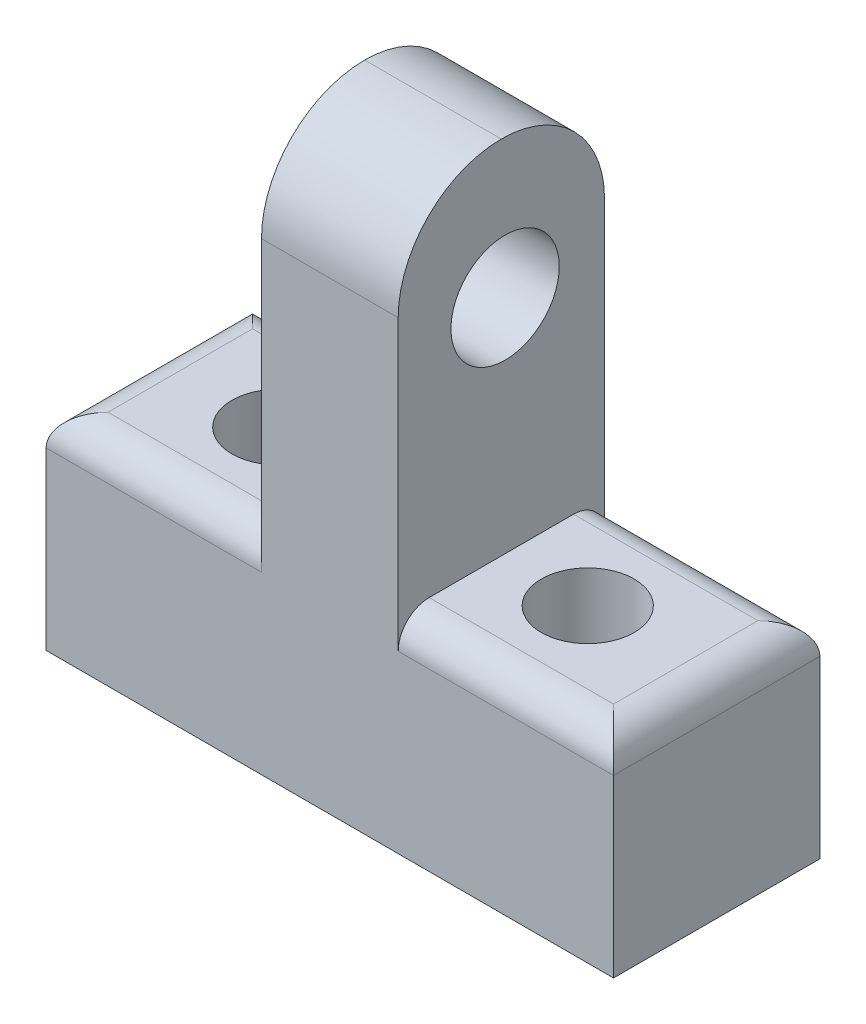
ISO-10303-21;
HEADER;
FILE_DESCRIPTION(('STEP AP214'),'2;1');
FILE_NAME('part.step','',(''),(''),'','','');
FILE_SCHEMA(('AUTOMOTIVE_DESIGN { 1 0 10303 214 1 1 1 1 }'));
ENDSEC;
DATA;
#1=APPLICATION_CONTEXT('core data for automotive mechanical design processes');
#2=APPLICATION_PROTOCOL_DEFINITION('international standard','automotive_design',2000,#1);
#3=PRODUCT_CONTEXT('',#1,'mechanical');
#4=PRODUCT('Part','Part','',(#3));
#5=PRODUCT_RELATED_PRODUCT_CATEGORY('part','',(#4));
#6=PRODUCT_DEFINITION_FORMATION('','',#4);
#7=PRODUCT_DEFINITION_CONTEXT('part definition',#1,'design');
#8=PRODUCT_DEFINITION('design','',#6,#7);
#9=PRODUCT_DEFINITION_SHAPE('','',#8);
#10=(LENGTH_UNIT() NAMED_UNIT(*) SI_UNIT(.MILLI.,.METRE.));
#11=(NAMED_UNIT(*) PLANE_ANGLE_UNIT() SI_UNIT($,.RADIAN.));
#12=(NAMED_UNIT(*) SI_UNIT($,.STERADIAN.) SOLID_ANGLE_UNIT());
#13=UNCERTAINTY_MEASURE_WITH_UNIT(LENGTH_MEASURE(1.E-05),#10,'distance_accuracy_value','');
#14=(GEOMETRIC_REPRESENTATION_CONTEXT(3) GLOBAL_UNCERTAINTY_ASSIGNED_CONTEXT((#13)) GLOBAL_UNIT_ASSIGNED_CONTEXT((#10,
#11,#12)) REPRESENTATION_CONTEXT('',''));
#15=CARTESIAN_POINT('',(0.,0.,0.));
#16=DIRECTION('',(0.,0.,1.));
#17=DIRECTION('',(1.,0.,0.));
#18=AXIS2_PLACEMENT_3D('',#15,#16,#17);
#19=CARTESIAN_POINT('',(0.,20.,0.));
#20=DIRECTION('',(0.,-1.,0.));
#21=DIRECTION('',(0.,0.,-1.));
#22=AXIS2_PLACEMENT_3D('',#19,#20,#21);
#23=PLANE('',#22);
#24=CARTESIAN_POINT('',(15.,20.,0.));
#25=DIRECTION('',(0.,1.,0.));
#26=DIRECTION('',(0.,0.,-1.));
#27=AXIS2_PLACEMENT_3D('',#24,#25,#26);
#28=CIRCLE('',#27,4.5);
#29=CARTESIAN_POINT('',(15.,20.,-4.50000000000001));
#30=VERTEX_POINT('',#29);
#31=EDGE_CURVE('E305',#30,#30,#28,.T.);
#32=ORIENTED_EDGE('',*,*,#31,.F.);
#33=EDGE_LOOP('',(#32));
#34=FACE_BOUND('',#33,.T.);
#35=DIRECTION('',(0.,0.,-1.));
#36=VECTOR('',#35,1.);
#37=CARTESIAN_POINT('',(6.62684365523114,20.,10.));
#38=LINE('',#37,#36);
#39=CARTESIAN_POINT('',(6.62684365523114,20.,7.));
#40=VERTEX_POINT('',#39);
#41=CARTESIAN_POINT('',(6.62684365523114,20.,-7.));
#42=VERTEX_POINT('',#41);
#43=EDGE_CURVE('E277',#40,#42,#38,.T.);
#44=ORIENTED_EDGE('',*,*,#43,.F.);
#45=DIRECTION('',(1.,0.,0.));
#46=VECTOR('',#45,1.);
#47=CARTESIAN_POINT('',(0.,20.,7.));
#48=LINE('',#47,#46);
#49=CARTESIAN_POINT('',(24.5,20.,7.));
#50=VERTEX_POINT('',#49);
#51=EDGE_CURVE('E245',#40,#50,#48,.T.);
#52=ORIENTED_EDGE('',*,*,#51,.T.);
#53=DIRECTION('',(0.,0.,-1.));
#54=VECTOR('',#53,1.);
#55=CARTESIAN_POINT('',(24.5,20.,0.));
#56=LINE('',#55,#54);
#57=CARTESIAN_POINT('',(24.5,20.,-7.));
#58=VERTEX_POINT('',#57);
#59=EDGE_CURVE('E242',#50,#58,#56,.T.);
#60=ORIENTED_EDGE('',*,*,#59,.T.);
#61=DIRECTION('',(-1.,0.,0.));
#62=VECTOR('',#61,1.);
#63=CARTESIAN_POINT('',(0.,20.,-7.));
#64=LINE('',#63,#62);
#65=EDGE_CURVE('E232',#58,#42,#64,.T.);
#66=ORIENTED_EDGE('',*,*,#65,.T.);
#67=EDGE_LOOP('',(#44,#52,#60,#66));
#68=FACE_BOUND('',#67,.T.);
#69=ADVANCED_FACE('F39',(#34,#68),#23,.F.);
#70=DIRECTION('',(0.,0.,1.));
#71=VECTOR('',#70,1.);
#72=CARTESIAN_POINT('',(-24.5,20.,0.));
#73=LINE('',#72,#71);
#74=CARTESIAN_POINT('',(-24.5,20.,-7.));
#75=VERTEX_POINT('',#74);
#76=CARTESIAN_POINT('',(-24.5,20.,7.));
#77=VERTEX_POINT('',#76);
#78=EDGE_CURVE('E199',#75,#77,#73,.T.);
#79=ORIENTED_EDGE('',*,*,#78,.T.);
#80=DIRECTION('',(1.,0.,0.));
#81=VECTOR('',#80,1.);
#82=CARTESIAN_POINT('',(0.,20.,7.));
#83=LINE('',#82,#81);
#84=CARTESIAN_POINT('',(-6.62684365523114,20.,7.));
#85=VERTEX_POINT('',#84);
#86=EDGE_CURVE('E211',#77,#85,#83,.T.);
#87=ORIENTED_EDGE('',*,*,#86,.T.);
#88=DIRECTION('',(0.,0.,-1.));
#89=VECTOR('',#88,1.);
#90=CARTESIAN_POINT('',(-6.62684365523114,20.,10.));
#91=LINE('',#90,#89);
#92=CARTESIAN_POINT('',(-6.62684365523114,20.,-7.));
#93=VERTEX_POINT('',#92);
#94=EDGE_CURVE('E282',#85,#93,#91,.T.);
#95=ORIENTED_EDGE('',*,*,#94,.T.);
#96=DIRECTION('',(-1.,0.,0.));
#97=VECTOR('',#96,1.);
#98=CARTESIAN_POINT('',(0.,20.,-7.));
#99=LINE('',#98,#97);
#100=EDGE_CURVE('E208',#93,#75,#99,.T.);
#101=ORIENTED_EDGE('',*,*,#100,.T.);
#102=EDGE_LOOP('',(#79,#87,#95,#101));
#103=FACE_BOUND('',#102,.T.);
#104=CARTESIAN_POINT('',(-15.,20.,0.));
#105=DIRECTION('',(0.,1.,0.));
#106=DIRECTION('',(0.,0.,1.));
#107=AXIS2_PLACEMENT_3D('',#104,#105,#106);
#108=CIRCLE('',#107,4.5);
#109=CARTESIAN_POINT('',(-15.,20.,4.5));
#110=VERTEX_POINT('',#109);
#111=EDGE_CURVE('E162',#110,#110,#108,.T.);
#112=ORIENTED_EDGE('',*,*,#111,.F.);
#113=EDGE_LOOP('',(#112));
#114=FACE_BOUND('',#113,.T.);
#115=ADVANCED_FACE('F330',(#103,#114),#23,.F.);
#116=CARTESIAN_POINT('',(0.,0.,0.));
#117=DIRECTION('',(0.,-1.,0.));
#118=DIRECTION('',(0.,0.,-1.));
#119=AXIS2_PLACEMENT_3D('',#116,#117,#118);
#120=PLANE('',#119);
#121=CARTESIAN_POINT('',(-15.,0.,0.));
#122=DIRECTION('',(0.,1.,0.));
#123=DIRECTION('',(0.,0.,1.));
#124=AXIS2_PLACEMENT_3D('',#121,#122,#123);
#125=CIRCLE('',#124,4.5);
#126=CARTESIAN_POINT('',(-15.,0.,4.5));
#127=VERTEX_POINT('',#126);
#128=EDGE_CURVE('E166',#127,#127,#125,.T.);
#129=ORIENTED_EDGE('',*,*,#128,.T.);
#130=EDGE_LOOP('',(#129));
#131=FACE_BOUND('',#130,.T.);
#132=DIRECTION('',(0.,0.,-1.));
#133=VECTOR('',#132,1.);
#134=CARTESIAN_POINT('',(27.5,0.,10.));
#135=LINE('',#134,#133);
#136=CARTESIAN_POINT('',(27.5,0.,10.));
#137=VERTEX_POINT('',#136);
#138=CARTESIAN_POINT('',(27.5,0.,-10.));
#139=VERTEX_POINT('',#138);
#140=EDGE_CURVE('E152',#137,#139,#135,.T.);
#141=ORIENTED_EDGE('',*,*,#140,.F.);
#142=DIRECTION('',(1.,0.,0.));
#143=VECTOR('',#142,1.);
#144=CARTESIAN_POINT('',(-27.5,0.,10.));
#145=LINE('',#144,#143);
#146=CARTESIAN_POINT('',(-27.5,0.,10.));
#147=VERTEX_POINT('',#146);
#148=EDGE_CURVE('E172',#147,#137,#145,.T.);
#149=ORIENTED_EDGE('',*,*,#148,.F.);
#150=DIRECTION('',(0.,0.,1.));
#151=VECTOR('',#150,1.);
#152=CARTESIAN_POINT('',(-27.5,0.,10.));
#153=LINE('',#152,#151);
#154=CARTESIAN_POINT('',(-27.5,0.,-10.));
#155=VERTEX_POINT('',#154);
#156=EDGE_CURVE('E154',#155,#147,#153,.T.);
#157=ORIENTED_EDGE('',*,*,#156,.F.);
#158=DIRECTION('',(-1.,0.,0.));
#159=VECTOR('',#158,1.);
#160=CARTESIAN_POINT('',(-27.5,0.,-10.));
#161=LINE('',#160,#159);
#162=EDGE_CURVE('E138',#139,#155,#161,.T.);
#163=ORIENTED_EDGE('',*,*,#162,.F.);
#164=EDGE_LOOP('',(#141,#149,#157,#163));
#165=FACE_BOUND('',#164,.T.);
#166=CARTESIAN_POINT('',(15.,0.,0.));
#167=DIRECTION('',(0.,1.,0.));
#168=DIRECTION('',(0.,0.,-1.));
#169=AXIS2_PLACEMENT_3D('',#166,#167,#168);
#170=CIRCLE('',#169,4.5);
#171=CARTESIAN_POINT('',(15.,0.,-4.50000000000001));
#172=VERTEX_POINT('',#171);
#173=EDGE_CURVE('E296',#172,#172,#170,.T.);
#174=ORIENTED_EDGE('',*,*,#173,.T.);
#175=EDGE_LOOP('',(#174));
#176=FACE_BOUND('',#175,.T.);
#177=ADVANCED_FACE('F149',(#131,#165,#176),#120,.T.);
#178=CARTESIAN_POINT('',(27.5,20.,10.));
#179=DIRECTION('',(-1.,0.,0.));
#180=DIRECTION('',(0.,0.,1.));
#181=AXIS2_PLACEMENT_3D('',#178,#179,#180);
#182=PLANE('',#181);
#183=DIRECTION('',(0.,-1.,0.));
#184=VECTOR('',#183,1.);
#185=CARTESIAN_POINT('',(27.5,20.,-10.));
#186=LINE('',#185,#184);
#187=CARTESIAN_POINT('',(27.5,17.,-10.));
#188=VERTEX_POINT('',#187);
#189=EDGE_CURVE('E134',#188,#139,#186,.T.);
#190=ORIENTED_EDGE('',*,*,#189,.F.);
#191=DIRECTION('',(0.,0.,-1.));
#192=VECTOR('',#191,1.);
#193=CARTESIAN_POINT('',(27.5,17.,10.));
#194=LINE('',#193,#192);
#195=CARTESIAN_POINT('',(27.5,17.,10.));
#196=VERTEX_POINT('',#195);
#197=EDGE_CURVE('E253',#188,#196,#194,.F.);
#198=ORIENTED_EDGE('',*,*,#197,.T.);
#199=DIRECTION('',(0.,-1.,0.));
#200=VECTOR('',#199,1.);
#201=CARTESIAN_POINT('',(27.5,20.,10.));
#202=LINE('',#201,#200);
#203=EDGE_CURVE('E159',#196,#137,#202,.T.);
#204=ORIENTED_EDGE('',*,*,#203,.T.);
#205=ORIENTED_EDGE('',*,*,#140,.T.);
#206=EDGE_LOOP('',(#190,#198,#204,#205));
#207=FACE_BOUND('',#206,.T.);
#208=ADVANCED_FACE('F157',(#207),#182,.F.);
#209=CARTESIAN_POINT('',(-27.5,20.,-10.));
#210=DIRECTION('',(0.,0.,1.));
#211=DIRECTION('',(1.,0.,0.));
#212=AXIS2_PLACEMENT_3D('',#209,#210,#211);
#213=PLANE('',#212);
#214=DIRECTION('',(0.,-1.,0.));
#215=VECTOR('',#214,1.);
#216=CARTESIAN_POINT('',(6.62684365523114,55.,-10.));
#217=LINE('',#216,#215);
#218=CARTESIAN_POINT('',(6.62684365523114,45.,-10.));
#219=VERTEX_POINT('',#218);
#220=CARTESIAN_POINT('',(6.62684365523114,17.,-10.));
#221=VERTEX_POINT('',#220);
#222=EDGE_CURVE('E57',#219,#221,#217,.T.);
#223=ORIENTED_EDGE('',*,*,#222,.T.);
#224=DIRECTION('',(-1.,0.,0.));
#225=VECTOR('',#224,1.);
#226=CARTESIAN_POINT('',(-27.5,17.,-10.));
#227=LINE('',#226,#225);
#228=EDGE_CURVE('E61',#221,#188,#227,.F.);
#229=ORIENTED_EDGE('',*,*,#228,.T.);
#230=ORIENTED_EDGE('',*,*,#189,.T.);
#231=ORIENTED_EDGE('',*,*,#162,.T.);
#232=DIRECTION('',(0.,-1.,0.));
#233=VECTOR('',#232,1.);
#234=CARTESIAN_POINT('',(-27.5,20.,-10.));
#235=LINE('',#234,#233);
#236=CARTESIAN_POINT('',(-27.5,17.,-10.));
#237=VERTEX_POINT('',#236);
#238=EDGE_CURVE('E145',#237,#155,#235,.T.);
#239=ORIENTED_EDGE('',*,*,#238,.F.);
#240=DIRECTION('',(-1.,0.,0.));
#241=VECTOR('',#240,1.);
#242=CARTESIAN_POINT('',(-27.5,17.,-10.));
#243=LINE('',#242,#241);
#244=CARTESIAN_POINT('',(-6.62684365523114,17.,-10.));
#245=VERTEX_POINT('',#244);
#246=EDGE_CURVE('E218',#237,#245,#243,.F.);
#247=ORIENTED_EDGE('',*,*,#246,.T.);
#248=DIRECTION('',(0.,-1.,0.));
#249=VECTOR('',#248,1.);
#250=CARTESIAN_POINT('',(-6.62684365523114,55.,-10.));
#251=LINE('',#250,#249);
#252=CARTESIAN_POINT('',(-6.62684365523114,45.,-10.));
#253=VERTEX_POINT('',#252);
#254=EDGE_CURVE('E293',#253,#245,#251,.T.);
#255=ORIENTED_EDGE('',*,*,#254,.F.);
#256=DIRECTION('',(1.,0.,0.));
#257=VECTOR('',#256,1.);
#258=CARTESIAN_POINT('',(6.62684365523114,45.,-10.));
#259=LINE('',#258,#257);
#260=EDGE_CURVE('E144',#253,#219,#259,.T.);
#261=ORIENTED_EDGE('',*,*,#260,.T.);
#262=EDGE_LOOP('',(#223,#229,#230,#231,#239,#247,#255,#261));
#263=FACE_BOUND('',#262,.T.);
#264=ADVANCED_FACE('F136',(#263),#213,.F.);
#265=CARTESIAN_POINT('',(-27.5,20.,10.));
#266=DIRECTION('',(1.,0.,0.));
#267=DIRECTION('',(0.,0.,-1.));
#268=AXIS2_PLACEMENT_3D('',#265,#266,#267);
#269=PLANE('',#268);
#270=DIRECTION('',(0.,-1.,0.));
#271=VECTOR('',#270,1.);
#272=CARTESIAN_POINT('',(-27.5,20.,10.));
#273=LINE('',#272,#271);
#274=CARTESIAN_POINT('',(-27.5,17.,10.));
#275=VERTEX_POINT('',#274);
#276=EDGE_CURVE('E177',#275,#147,#273,.T.);
#277=ORIENTED_EDGE('',*,*,#276,.F.);
#278=DIRECTION('',(0.,0.,1.));
#279=VECTOR('',#278,1.);
#280=CARTESIAN_POINT('',(-27.5,17.,10.));
#281=LINE('',#280,#279);
#282=EDGE_CURVE('E222',#275,#237,#281,.F.);
#283=ORIENTED_EDGE('',*,*,#282,.T.);
#284=ORIENTED_EDGE('',*,*,#238,.T.);
#285=ORIENTED_EDGE('',*,*,#156,.T.);
#286=EDGE_LOOP('',(#277,#283,#284,#285));
#287=FACE_BOUND('',#286,.T.);
#288=ADVANCED_FACE('F344',(#287),#269,.F.);
#289=CARTESIAN_POINT('',(-27.5,20.,10.));
#290=DIRECTION('',(0.,0.,-1.));
#291=DIRECTION('',(-1.,0.,0.));
#292=AXIS2_PLACEMENT_3D('',#289,#290,#291);
#293=PLANE('',#292);
#294=ORIENTED_EDGE('',*,*,#203,.F.);
#295=DIRECTION('',(1.,0.,0.));
#296=VECTOR('',#295,1.);
#297=CARTESIAN_POINT('',(-27.5,17.,10.));
#298=LINE('',#297,#296);
#299=CARTESIAN_POINT('',(6.62684365523114,17.,10.));
#300=VERTEX_POINT('',#299);
#301=EDGE_CURVE('E249',#196,#300,#298,.F.);
#302=ORIENTED_EDGE('',*,*,#301,.T.);
#303=DIRECTION('',(0.,-1.,0.));
#304=VECTOR('',#303,1.);
#305=CARTESIAN_POINT('',(6.62684365523114,55.,10.));
#306=LINE('',#305,#304);
#307=CARTESIAN_POINT('',(6.62684365523114,45.,10.));
#308=VERTEX_POINT('',#307);
#309=EDGE_CURVE('E300',#308,#300,#306,.T.);
#310=ORIENTED_EDGE('',*,*,#309,.F.);
#311=DIRECTION('',(1.,0.,0.));
#312=VECTOR('',#311,1.);
#313=CARTESIAN_POINT('',(-6.62684365523114,45.,10.));
#314=LINE('',#313,#312);
#315=CARTESIAN_POINT('',(-6.62684365523114,45.,10.));
#316=VERTEX_POINT('',#315);
#317=EDGE_CURVE('E196',#308,#316,#314,.F.);
#318=ORIENTED_EDGE('',*,*,#317,.T.);
#319=DIRECTION('',(0.,-1.,0.));
#320=VECTOR('',#319,1.);
#321=CARTESIAN_POINT('',(-6.62684365523114,55.,10.));
#322=LINE('',#321,#320);
#323=CARTESIAN_POINT('',(-6.62684365523114,17.,10.));
#324=VERTEX_POINT('',#323);
#325=EDGE_CURVE('E297',#316,#324,#322,.T.);
#326=ORIENTED_EDGE('',*,*,#325,.T.);
#327=DIRECTION('',(1.,0.,0.));
#328=VECTOR('',#327,1.);
#329=CARTESIAN_POINT('',(-27.5,17.,10.));
#330=LINE('',#329,#328);
#331=EDGE_CURVE('E215',#324,#275,#330,.F.);
#332=ORIENTED_EDGE('',*,*,#331,.T.);
#333=ORIENTED_EDGE('',*,*,#276,.T.);
#334=ORIENTED_EDGE('',*,*,#148,.T.);
#335=EDGE_LOOP('',(#294,#302,#310,#318,#326,#332,#333,#334));
#336=FACE_BOUND('',#335,.T.);
#337=ADVANCED_FACE('F325',(#336),#293,.F.);
#338=CARTESIAN_POINT('',(-15.,20.,0.));
#339=DIRECTION('',(0.,-1.,0.));
#340=DIRECTION('',(0.,0.,-1.));
#341=AXIS2_PLACEMENT_3D('',#338,#339,#340);
#342=CYLINDRICAL_SURFACE('',#341,4.5);
#343=ORIENTED_EDGE('',*,*,#111,.T.);
#344=EDGE_LOOP('',(#343));
#345=FACE_BOUND('',#344,.T.);
#346=ORIENTED_EDGE('',*,*,#128,.F.);
#347=EDGE_LOOP('',(#346));
#348=FACE_BOUND('',#347,.T.);
#349=ADVANCED_FACE('F316',(#345,#348),#342,.F.);
#350=CARTESIAN_POINT('',(15.,20.,0.));
#351=DIRECTION('',(0.,-1.,0.));
#352=DIRECTION('',(0.,0.,-1.));
#353=AXIS2_PLACEMENT_3D('',#350,#351,#352);
#354=CYLINDRICAL_SURFACE('',#353,4.5);
#355=ORIENTED_EDGE('',*,*,#31,.T.);
#356=EDGE_LOOP('',(#355));
#357=FACE_BOUND('',#356,.T.);
#358=ORIENTED_EDGE('',*,*,#173,.F.);
#359=EDGE_LOOP('',(#358));
#360=FACE_BOUND('',#359,.T.);
#361=ADVANCED_FACE('F313',(#357,#360),#354,.F.);
#362=CARTESIAN_POINT('',(-6.62684365523114,55.,10.));
#363=DIRECTION('',(-1.,0.,0.));
#364=DIRECTION('',(0.,0.,1.));
#365=AXIS2_PLACEMENT_3D('',#362,#363,#364);
#366=PLANE('',#365);
#367=CARTESIAN_POINT('',(-6.62684365523114,41.5,-0.362292653099804));
#368=DIRECTION('',(-1.,0.,0.));
#369=DIRECTION('',(0.,0.,1.));
#370=AXIS2_PLACEMENT_3D('',#367,#368,#369);
#371=CIRCLE('',#370,5.25);
#372=CARTESIAN_POINT('',(-6.62684365523114,41.5,4.88770734690019));
#373=VERTEX_POINT('',#372);
#374=EDGE_CURVE('E283',#373,#373,#371,.T.);
#375=ORIENTED_EDGE('',*,*,#374,.F.);
#376=EDGE_LOOP('',(#375));
#377=FACE_BOUND('',#376,.T.);
#378=CARTESIAN_POINT('',(-6.62684365523114,45.,0.));
#379=DIRECTION('',(-1.,0.,0.));
#380=DIRECTION('',(0.,0.,1.));
#381=AXIS2_PLACEMENT_3D('',#378,#379,#380);
#382=CIRCLE('',#381,10.);
#383=CARTESIAN_POINT('',(-6.62684365523114,55.,0.));
#384=VERTEX_POINT('',#383);
#385=EDGE_CURVE('E190',#316,#384,#382,.T.);
#386=ORIENTED_EDGE('',*,*,#385,.T.);
#387=CARTESIAN_POINT('',(-6.62684365523114,45.,0.));
#388=DIRECTION('',(-1.,0.,0.));
#389=DIRECTION('',(0.,0.,1.));
#390=AXIS2_PLACEMENT_3D('',#387,#388,#389);
#391=CIRCLE('',#390,10.);
#392=EDGE_CURVE('E193',#384,#253,#391,.T.);
#393=ORIENTED_EDGE('',*,*,#392,.T.);
#394=ORIENTED_EDGE('',*,*,#254,.T.);
#395=CARTESIAN_POINT('',(-6.62684365523114,17.,-7.));
#396=DIRECTION('',(-1.,0.,0.));
#397=DIRECTION('',(0.,0.,1.));
#398=AXIS2_PLACEMENT_3D('',#395,#396,#397);
#399=CIRCLE('',#398,3.);
#400=EDGE_CURVE('E229',#245,#93,#399,.F.);
#401=ORIENTED_EDGE('',*,*,#400,.T.);
#402=ORIENTED_EDGE('',*,*,#94,.F.);
#403=CARTESIAN_POINT('',(-6.62684365523114,17.,7.));
#404=DIRECTION('',(-1.,0.,0.));
#405=DIRECTION('',(0.,0.,1.));
#406=AXIS2_PLACEMENT_3D('',#403,#404,#405);
#407=CIRCLE('',#406,3.);
#408=EDGE_CURVE('E225',#85,#324,#407,.F.);
#409=ORIENTED_EDGE('',*,*,#408,.T.);
#410=ORIENTED_EDGE('',*,*,#325,.F.);
#411=EDGE_LOOP('',(#386,#393,#394,#401,#402,#409,#410));
#412=FACE_BOUND('',#411,.T.);
#413=ADVANCED_FACE('F315',(#377,#412),#366,.T.);
#414=CARTESIAN_POINT('',(6.62684365523114,55.,10.));
#415=DIRECTION('',(-1.,0.,0.));
#416=DIRECTION('',(0.,0.,1.));
#417=AXIS2_PLACEMENT_3D('',#414,#415,#416);
#418=PLANE('',#417);
#419=CARTESIAN_POINT('',(6.62684365523114,41.5,-0.362292653099804));
#420=DIRECTION('',(1.,0.,0.));
#421=DIRECTION('',(0.,0.,-1.));
#422=AXIS2_PLACEMENT_3D('',#419,#420,#421);
#423=CIRCLE('',#422,5.25);
#424=CARTESIAN_POINT('',(6.62684365523114,41.5,-5.6122926530998));
#425=VERTEX_POINT('',#424);
#426=EDGE_CURVE('E204',#425,#425,#423,.T.);
#427=ORIENTED_EDGE('',*,*,#426,.F.);
#428=EDGE_LOOP('',(#427));
#429=FACE_BOUND('',#428,.T.);
#430=ORIENTED_EDGE('',*,*,#222,.F.);
#431=CARTESIAN_POINT('',(6.62684365523114,45.,0.));
#432=DIRECTION('',(-1.,0.,0.));
#433=DIRECTION('',(0.,0.,1.));
#434=AXIS2_PLACEMENT_3D('',#431,#432,#433);
#435=CIRCLE('',#434,10.);
#436=CARTESIAN_POINT('',(6.62684365523114,55.,0.));
#437=VERTEX_POINT('',#436);
#438=EDGE_CURVE('E187',#219,#437,#435,.F.);
#439=ORIENTED_EDGE('',*,*,#438,.T.);
#440=CARTESIAN_POINT('',(6.62684365523114,45.,0.));
#441=DIRECTION('',(-1.,0.,0.));
#442=DIRECTION('',(0.,0.,1.));
#443=AXIS2_PLACEMENT_3D('',#440,#441,#442);
#444=CIRCLE('',#443,10.);
#445=EDGE_CURVE('E184',#437,#308,#444,.F.);
#446=ORIENTED_EDGE('',*,*,#445,.T.);
#447=ORIENTED_EDGE('',*,*,#309,.T.);
#448=CARTESIAN_POINT('',(6.62684365523114,17.,7.));
#449=DIRECTION('',(-1.,0.,0.));
#450=DIRECTION('',(0.,0.,1.));
#451=AXIS2_PLACEMENT_3D('',#448,#449,#450);
#452=CIRCLE('',#451,3.);
#453=EDGE_CURVE('E49',#300,#40,#452,.T.);
#454=ORIENTED_EDGE('',*,*,#453,.T.);
#455=ORIENTED_EDGE('',*,*,#43,.T.);
#456=CARTESIAN_POINT('',(6.62684365523114,17.,-7.));
#457=DIRECTION('',(-1.,0.,0.));
#458=DIRECTION('',(0.,0.,1.));
#459=AXIS2_PLACEMENT_3D('',#456,#457,#458);
#460=CIRCLE('',#459,3.);
#461=EDGE_CURVE('E11',#42,#221,#460,.T.);
#462=ORIENTED_EDGE('',*,*,#461,.T.);
#463=EDGE_LOOP('',(#430,#439,#446,#447,#454,#455,#462));
#464=FACE_BOUND('',#463,.T.);
#465=ADVANCED_FACE('F279',(#429,#464),#418,.F.);
#466=CARTESIAN_POINT('',(-23.3731563447689,41.5,-0.362292653099804));
#467=DIRECTION('',(1.,0.,0.));
#468=DIRECTION('',(0.,0.,-1.));
#469=AXIS2_PLACEMENT_3D('',#466,#467,#468);
#470=CYLINDRICAL_SURFACE('',#469,5.25);
#471=ORIENTED_EDGE('',*,*,#374,.T.);
#472=EDGE_LOOP('',(#471));
#473=FACE_BOUND('',#472,.T.);
#474=ORIENTED_EDGE('',*,*,#426,.T.);
#475=EDGE_LOOP('',(#474));
#476=FACE_BOUND('',#475,.T.);
#477=ADVANCED_FACE('F361',(#473,#476),#470,.F.);
#478=CARTESIAN_POINT('',(0.,45.,0.));
#479=DIRECTION('',(-1.,0.,0.));
#480=DIRECTION('',(0.,0.,1.));
#481=AXIS2_PLACEMENT_3D('',#478,#479,#480);
#482=CYLINDRICAL_SURFACE('',#481,10.);
#483=DIRECTION('',(1.,0.,0.));
#484=VECTOR('',#483,1.);
#485=CARTESIAN_POINT('',(6.62684365523114,55.,0.));
#486=LINE('',#485,#484);
#487=EDGE_CURVE('E200',#384,#437,#486,.T.);
#488=ORIENTED_EDGE('',*,*,#487,.F.);
#489=ORIENTED_EDGE('',*,*,#385,.F.);
#490=ORIENTED_EDGE('',*,*,#317,.F.);
#491=ORIENTED_EDGE('',*,*,#445,.F.);
#492=EDGE_LOOP('',(#488,#489,#490,#491));
#493=FACE_BOUND('',#492,.T.);
#494=ADVANCED_FACE('F357',(#493),#482,.T.);
#495=CARTESIAN_POINT('',(-27.5,45.,0.));
#496=DIRECTION('',(-1.,0.,0.));
#497=DIRECTION('',(0.,0.,1.));
#498=AXIS2_PLACEMENT_3D('',#495,#496,#497);
#499=CYLINDRICAL_SURFACE('',#498,10.);
#500=ORIENTED_EDGE('',*,*,#392,.F.);
#501=ORIENTED_EDGE('',*,*,#487,.T.);
#502=ORIENTED_EDGE('',*,*,#438,.F.);
#503=ORIENTED_EDGE('',*,*,#260,.F.);
#504=EDGE_LOOP('',(#500,#501,#502,#503));
#505=FACE_BOUND('',#504,.T.);
#506=ADVANCED_FACE('F353',(#505),#499,.T.);
#507=CARTESIAN_POINT('',(0.,17.,-7.));
#508=DIRECTION('',(-1.,0.,0.));
#509=DIRECTION('',(0.,0.,1.));
#510=AXIS2_PLACEMENT_3D('',#507,#508,#509);
#511=CYLINDRICAL_SURFACE('',#510,3.);
#512=ORIENTED_EDGE('',*,*,#400,.F.);
#513=ORIENTED_EDGE('',*,*,#246,.F.);
#514=CARTESIAN_POINT('',(-24.5,17.,-7.));
#515=DIRECTION('',(-0.707106781186547,0.,0.707106781186547));
#516=DIRECTION('',(0.707106781186547,0.,0.707106781186547));
#517=AXIS2_PLACEMENT_3D('',#514,#515,#516);
#518=ELLIPSE('',#517,4.24264068711928,3.);
#519=EDGE_CURVE('E205',#75,#237,#518,.T.);
#520=ORIENTED_EDGE('',*,*,#519,.F.);
#521=ORIENTED_EDGE('',*,*,#100,.F.);
#522=EDGE_LOOP('',(#512,#513,#520,#521));
#523=FACE_BOUND('',#522,.T.);
#524=ADVANCED_FACE('F356',(#523),#511,.T.);
#525=CARTESIAN_POINT('',(-24.5,17.,0.));
#526=DIRECTION('',(0.,0.,1.));
#527=DIRECTION('',(1.,0.,0.));
#528=AXIS2_PLACEMENT_3D('',#525,#526,#527);
#529=CYLINDRICAL_SURFACE('',#528,3.);
#530=ORIENTED_EDGE('',*,*,#519,.T.);
#531=ORIENTED_EDGE('',*,*,#282,.F.);
#532=CARTESIAN_POINT('',(-24.5,17.,7.));
#533=DIRECTION('',(0.707106781186547,0.,0.707106781186547));
#534=DIRECTION('',(-0.707106781186547,0.,0.707106781186547));
#535=AXIS2_PLACEMENT_3D('',#532,#533,#534);
#536=ELLIPSE('',#535,4.24264068711928,3.);
#537=EDGE_CURVE('E233',#77,#275,#536,.T.);
#538=ORIENTED_EDGE('',*,*,#537,.F.);
#539=ORIENTED_EDGE('',*,*,#78,.F.);
#540=EDGE_LOOP('',(#530,#531,#538,#539));
#541=FACE_BOUND('',#540,.T.);
#542=ADVANCED_FACE('F366',(#541),#529,.T.);
#543=CARTESIAN_POINT('',(0.,17.,7.));
#544=DIRECTION('',(1.,0.,0.));
#545=DIRECTION('',(0.,0.,-1.));
#546=AXIS2_PLACEMENT_3D('',#543,#544,#545);
#547=CYLINDRICAL_SURFACE('',#546,3.);
#548=ORIENTED_EDGE('',*,*,#537,.T.);
#549=ORIENTED_EDGE('',*,*,#331,.F.);
#550=ORIENTED_EDGE('',*,*,#408,.F.);
#551=ORIENTED_EDGE('',*,*,#86,.F.);
#552=EDGE_LOOP('',(#548,#549,#550,#551));
#553=FACE_BOUND('',#552,.T.);
#554=ADVANCED_FACE('F363',(#553),#547,.T.);
#555=CARTESIAN_POINT('',(0.,17.,-7.));
#556=DIRECTION('',(-1.,0.,0.));
#557=DIRECTION('',(0.,0.,1.));
#558=AXIS2_PLACEMENT_3D('',#555,#556,#557);
#559=CYLINDRICAL_SURFACE('',#558,3.);
#560=ORIENTED_EDGE('',*,*,#461,.F.);
#561=ORIENTED_EDGE('',*,*,#65,.F.);
#562=CARTESIAN_POINT('',(24.5,17.,-7.));
#563=DIRECTION('',(-0.707106781186547,0.,-0.707106781186547));
#564=DIRECTION('',(-0.707106781186547,0.,0.707106781186547));
#565=AXIS2_PLACEMENT_3D('',#562,#563,#564);
#566=ELLIPSE('',#565,4.24264068711928,3.);
#567=EDGE_CURVE('E43',#188,#58,#566,.F.);
#568=ORIENTED_EDGE('',*,*,#567,.F.);
#569=ORIENTED_EDGE('',*,*,#228,.F.);
#570=EDGE_LOOP('',(#560,#561,#568,#569));
#571=FACE_BOUND('',#570,.T.);
#572=ADVANCED_FACE('F41',(#571),#559,.T.);
#573=CARTESIAN_POINT('',(24.5,17.,0.));
#574=DIRECTION('',(0.,0.,-1.));
#575=DIRECTION('',(-1.,0.,0.));
#576=AXIS2_PLACEMENT_3D('',#573,#574,#575);
#577=CYLINDRICAL_SURFACE('',#576,3.);
#578=ORIENTED_EDGE('',*,*,#567,.T.);
#579=ORIENTED_EDGE('',*,*,#59,.F.);
#580=CARTESIAN_POINT('',(24.5,17.,7.));
#581=DIRECTION('',(0.707106781186547,0.,-0.707106781186547));
#582=DIRECTION('',(-0.707106781186547,0.,-0.707106781186547));
#583=AXIS2_PLACEMENT_3D('',#580,#581,#582);
#584=ELLIPSE('',#583,4.24264068711928,3.);
#585=EDGE_CURVE('E259',#196,#50,#584,.F.);
#586=ORIENTED_EDGE('',*,*,#585,.F.);
#587=ORIENTED_EDGE('',*,*,#197,.F.);
#588=EDGE_LOOP('',(#578,#579,#586,#587));
#589=FACE_BOUND('',#588,.T.);
#590=ADVANCED_FACE('F270',(#589),#577,.T.);
#591=CARTESIAN_POINT('',(0.,17.,7.));
#592=DIRECTION('',(1.,0.,0.));
#593=DIRECTION('',(0.,0.,-1.));
#594=AXIS2_PLACEMENT_3D('',#591,#592,#593);
#595=CYLINDRICAL_SURFACE('',#594,3.);
#596=ORIENTED_EDGE('',*,*,#453,.F.);
#597=ORIENTED_EDGE('',*,*,#301,.F.);
#598=ORIENTED_EDGE('',*,*,#585,.T.);
#599=ORIENTED_EDGE('',*,*,#51,.F.);
#600=EDGE_LOOP('',(#596,#597,#598,#599));
#601=FACE_BOUND('',#600,.T.);
#602=ADVANCED_FACE('F374',(#601),#595,.T.);
#603=CLOSED_SHELL('',(#69,#115,#177,#208,#264,#288,#337,#349,#361,#413,#465,#477,#494,#506,#524,
#542,#554,#572,#590,#602));
#604=MANIFOLD_SOLID_BREP('B2',#603);
#605=ADVANCED_BREP_SHAPE_REPRESENTATION('',(#18,#604),#14);
#606=SHAPE_DEFINITION_REPRESENTATION(#9,#605);
ENDSEC;
END-ISO-10303-21;
